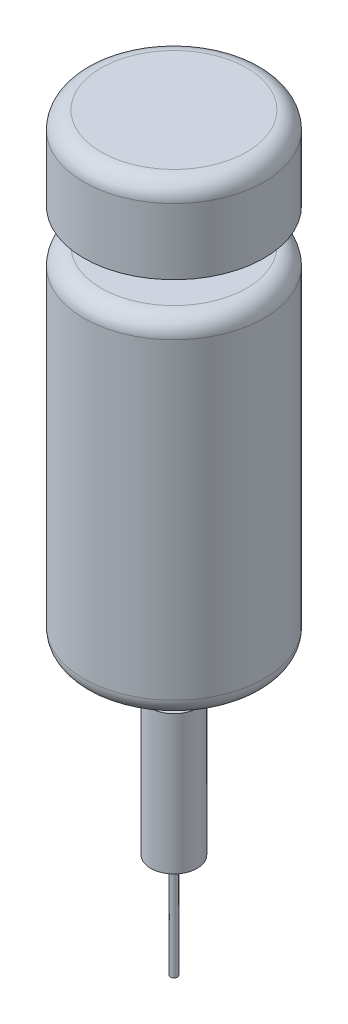
ISO-10303-21;
HEADER;
FILE_DESCRIPTION(('STEP AP214'),'2;1');
FILE_NAME('part.step','',(''),(''),'','','');
FILE_SCHEMA(('AUTOMOTIVE_DESIGN { 1 0 10303 214 1 1 1 1 }'));
ENDSEC;
DATA;
#1=APPLICATION_CONTEXT('core data for automotive mechanical design processes');
#2=APPLICATION_PROTOCOL_DEFINITION('international standard','automotive_design',2000,#1);
#3=PRODUCT_CONTEXT('',#1,'mechanical');
#4=PRODUCT('Part','Part','',(#3));
#5=PRODUCT_RELATED_PRODUCT_CATEGORY('part','',(#4));
#6=PRODUCT_DEFINITION_FORMATION('','',#4);
#7=PRODUCT_DEFINITION_CONTEXT('part definition',#1,'design');
#8=PRODUCT_DEFINITION('design','',#6,#7);
#9=PRODUCT_DEFINITION_SHAPE('','',#8);
#10=(LENGTH_UNIT() NAMED_UNIT(*) SI_UNIT(.MILLI.,.METRE.));
#11=(NAMED_UNIT(*) PLANE_ANGLE_UNIT() SI_UNIT($,.RADIAN.));
#12=(NAMED_UNIT(*) SI_UNIT($,.STERADIAN.) SOLID_ANGLE_UNIT());
#13=UNCERTAINTY_MEASURE_WITH_UNIT(LENGTH_MEASURE(1.E-05),#10,'distance_accuracy_value','');
#14=(GEOMETRIC_REPRESENTATION_CONTEXT(3) GLOBAL_UNCERTAINTY_ASSIGNED_CONTEXT((#13)) GLOBAL_UNIT_ASSIGNED_CONTEXT((#10,
#11,#12)) REPRESENTATION_CONTEXT('',''));
#15=CARTESIAN_POINT('',(0.,0.,0.));
#16=DIRECTION('',(0.,0.,1.));
#17=DIRECTION('',(1.,0.,0.));
#18=AXIS2_PLACEMENT_3D('',#15,#16,#17);
#19=CARTESIAN_POINT('',(0.,-52.,0.));
#20=DIRECTION('',(0.,-1.,0.));
#21=DIRECTION('',(0.,0.,-1.));
#22=AXIS2_PLACEMENT_3D('',#19,#20,#21);
#23=PLANE('',#22);
#24=CARTESIAN_POINT('',(0.,-52.,0.));
#25=DIRECTION('',(0.,-1.,0.));
#26=DIRECTION('',(0.,0.,-1.));
#27=AXIS2_PLACEMENT_3D('',#24,#25,#26);
#28=CIRCLE('',#27,6.69998497921417);
#29=CARTESIAN_POINT('',(0.,-52.,-6.69998497921417));
#30=VERTEX_POINT('',#29);
#31=EDGE_CURVE('E75',#30,#30,#28,.T.);
#32=ORIENTED_EDGE('',*,*,#31,.T.);
#33=EDGE_LOOP('',(#32));
#34=FACE_BOUND('',#33,.T.);
#35=CARTESIAN_POINT('',(0.,-52.,0.));
#36=DIRECTION('',(0.,-1.,0.));
#37=DIRECTION('',(0.,0.,-1.));
#38=AXIS2_PLACEMENT_3D('',#35,#36,#37);
#39=CIRCLE('',#38,1.);
#40=CARTESIAN_POINT('',(0.,-52.,-1.));
#41=VERTEX_POINT('',#40);
#42=EDGE_CURVE('E84',#41,#41,#39,.T.);
#43=ORIENTED_EDGE('',*,*,#42,.F.);
#44=EDGE_LOOP('',(#43));
#45=FACE_BOUND('',#44,.T.);
#46=ADVANCED_FACE('F30',(#34,#45),#23,.T.);
#47=CARTESIAN_POINT('',(0.,-8.,0.));
#48=DIRECTION('',(0.,-1.,0.));
#49=DIRECTION('',(0.,0.,-1.));
#50=AXIS2_PLACEMENT_3D('',#47,#48,#49);
#51=PLANE('',#50);
#52=CARTESIAN_POINT('',(0.,-8.,0.));
#53=DIRECTION('',(0.,-1.,0.));
#54=DIRECTION('',(0.,0.,-1.));
#55=AXIS2_PLACEMENT_3D('',#52,#53,#54);
#56=CIRCLE('',#55,10.);
#57=CARTESIAN_POINT('',(0.,-8.,-10.));
#58=VERTEX_POINT('',#57);
#59=EDGE_CURVE('E68',#58,#58,#56,.T.);
#60=ORIENTED_EDGE('',*,*,#59,.T.);
#61=EDGE_LOOP('',(#60));
#62=FACE_BOUND('',#61,.T.);
#63=CARTESIAN_POINT('',(0.,-8.,0.));
#64=DIRECTION('',(0.,-1.,0.));
#65=DIRECTION('',(0.,0.,-1.));
#66=AXIS2_PLACEMENT_3D('',#63,#64,#65);
#67=CIRCLE('',#66,2.93533656890052);
#68=CARTESIAN_POINT('',(0.,-8.,-2.93533656890052));
#69=VERTEX_POINT('',#68);
#70=EDGE_CURVE('E72',#69,#69,#67,.T.);
#71=ORIENTED_EDGE('',*,*,#70,.F.);
#72=EDGE_LOOP('',(#71));
#73=FACE_BOUND('',#72,.T.);
#74=ADVANCED_FACE('F100',(#62,#73),#51,.T.);
#75=CARTESIAN_POINT('',(0.,0.,0.));
#76=DIRECTION('',(0.,1.,0.));
#77=DIRECTION('',(0.,0.,1.));
#78=AXIS2_PLACEMENT_3D('',#75,#76,#77);
#79=PLANE('',#78);
#80=CARTESIAN_POINT('',(0.,0.,0.));
#81=DIRECTION('',(0.,1.,0.));
#82=DIRECTION('',(0.,0.,1.));
#83=AXIS2_PLACEMENT_3D('',#80,#81,#82);
#84=CIRCLE('',#83,21.);
#85=CARTESIAN_POINT('',(0.,0.,21.));
#86=VERTEX_POINT('',#85);
#87=EDGE_CURVE('E53',#86,#86,#84,.F.);
#88=ORIENTED_EDGE('',*,*,#87,.T.);
#89=EDGE_LOOP('',(#88));
#90=FACE_BOUND('',#89,.T.);
#91=CARTESIAN_POINT('',(0.,0.,0.));
#92=DIRECTION('',(0.,1.,0.));
#93=DIRECTION('',(0.,0.,1.));
#94=AXIS2_PLACEMENT_3D('',#91,#92,#93);
#95=CIRCLE('',#94,10.);
#96=CARTESIAN_POINT('',(0.,0.,10.));
#97=VERTEX_POINT('',#96);
#98=EDGE_CURVE('E10',#97,#97,#95,.F.);
#99=ORIENTED_EDGE('',*,*,#98,.F.);
#100=EDGE_LOOP('',(#99));
#101=FACE_BOUND('',#100,.T.);
#102=ADVANCED_FACE('F106',(#90,#101),#79,.F.);
#103=CARTESIAN_POINT('',(0.,100.,0.));
#104=DIRECTION('',(0.,1.,0.));
#105=DIRECTION('',(0.,0.,1.));
#106=AXIS2_PLACEMENT_3D('',#103,#104,#105);
#107=PLANE('',#106);
#108=CARTESIAN_POINT('',(0.,100.,0.));
#109=DIRECTION('',(0.,1.,0.));
#110=DIRECTION('',(0.,0.,1.));
#111=AXIS2_PLACEMENT_3D('',#108,#109,#110);
#112=CIRCLE('',#111,21.);
#113=CARTESIAN_POINT('',(0.,100.,21.));
#114=VERTEX_POINT('',#113);
#115=EDGE_CURVE('E50',#114,#114,#112,.T.);
#116=ORIENTED_EDGE('',*,*,#115,.T.);
#117=EDGE_LOOP('',(#116));
#118=FACE_BOUND('',#117,.T.);
#119=CARTESIAN_POINT('',(0.,100.,0.));
#120=DIRECTION('',(0.,1.,0.));
#121=DIRECTION('',(0.,0.,1.));
#122=AXIS2_PLACEMENT_3D('',#119,#120,#121);
#123=CIRCLE('',#122,7.5);
#124=CARTESIAN_POINT('',(0.,100.,7.5));
#125=VERTEX_POINT('',#124);
#126=EDGE_CURVE('E60',#125,#125,#123,.T.);
#127=ORIENTED_EDGE('',*,*,#126,.F.);
#128=EDGE_LOOP('',(#127));
#129=FACE_BOUND('',#128,.T.);
#130=ADVANCED_FACE('F143',(#118,#129),#107,.T.);
#131=CARTESIAN_POINT('',(0.,100.,0.));
#132=DIRECTION('',(0.,-1.,0.));
#133=DIRECTION('',(0.,0.,-1.));
#134=AXIS2_PLACEMENT_3D('',#131,#132,#133);
#135=CYLINDRICAL_SURFACE('',#134,26.);
#136=CARTESIAN_POINT('',(0.,95.,0.));
#137=DIRECTION('',(0.,1.,0.));
#138=DIRECTION('',(0.,0.,1.));
#139=AXIS2_PLACEMENT_3D('',#136,#137,#138);
#140=CIRCLE('',#139,26.);
#141=CARTESIAN_POINT('',(0.,95.,26.));
#142=VERTEX_POINT('',#141);
#143=EDGE_CURVE('E45',#142,#142,#140,.F.);
#144=ORIENTED_EDGE('',*,*,#143,.T.);
#145=EDGE_LOOP('',(#144));
#146=FACE_BOUND('',#145,.T.);
#147=CARTESIAN_POINT('',(0.,5.,0.));
#148=DIRECTION('',(0.,1.,0.));
#149=DIRECTION('',(0.,0.,1.));
#150=AXIS2_PLACEMENT_3D('',#147,#148,#149);
#151=CIRCLE('',#150,26.);
#152=CARTESIAN_POINT('',(0.,5.,26.));
#153=VERTEX_POINT('',#152);
#154=EDGE_CURVE('E56',#153,#153,#151,.T.);
#155=ORIENTED_EDGE('',*,*,#154,.T.);
#156=EDGE_LOOP('',(#155));
#157=FACE_BOUND('',#156,.T.);
#158=ADVANCED_FACE('F141',(#146,#157),#135,.T.);
#159=CARTESIAN_POINT('',(0.,110.,0.));
#160=DIRECTION('',(0.,-1.,0.));
#161=DIRECTION('',(0.,0.,-1.));
#162=AXIS2_PLACEMENT_3D('',#159,#160,#161);
#163=CYLINDRICAL_SURFACE('',#162,7.5);
#164=CARTESIAN_POINT('',(0.,110.,0.));
#165=DIRECTION('',(0.,1.,0.));
#166=DIRECTION('',(0.,0.,1.));
#167=AXIS2_PLACEMENT_3D('',#164,#165,#166);
#168=CIRCLE('',#167,7.5);
#169=CARTESIAN_POINT('',(0.,110.,7.5));
#170=VERTEX_POINT('',#169);
#171=EDGE_CURVE('E59',#170,#170,#168,.T.);
#172=ORIENTED_EDGE('',*,*,#171,.F.);
#173=EDGE_LOOP('',(#172));
#174=FACE_BOUND('',#173,.T.);
#175=ORIENTED_EDGE('',*,*,#126,.T.);
#176=EDGE_LOOP('',(#175));
#177=FACE_BOUND('',#176,.T.);
#178=ADVANCED_FACE('F135',(#174,#177),#163,.T.);
#179=CARTESIAN_POINT('',(0.,110.,0.));
#180=DIRECTION('',(0.,1.,0.));
#181=DIRECTION('',(0.,0.,1.));
#182=AXIS2_PLACEMENT_3D('',#179,#180,#181);
#183=PLANE('',#182);
#184=CARTESIAN_POINT('',(0.,110.,0.));
#185=DIRECTION('',(0.,1.,0.));
#186=DIRECTION('',(0.,0.,1.));
#187=AXIS2_PLACEMENT_3D('',#184,#185,#186);
#188=CIRCLE('',#187,26.);
#189=CARTESIAN_POINT('',(0.,110.,26.));
#190=VERTEX_POINT('',#189);
#191=EDGE_CURVE('E63',#190,#190,#188,.T.);
#192=ORIENTED_EDGE('',*,*,#191,.F.);
#193=EDGE_LOOP('',(#192));
#194=FACE_BOUND('',#193,.T.);
#195=ORIENTED_EDGE('',*,*,#171,.T.);
#196=EDGE_LOOP('',(#195));
#197=FACE_BOUND('',#196,.T.);
#198=ADVANCED_FACE('F132',(#194,#197),#183,.F.);
#199=CARTESIAN_POINT('',(0.,134.,0.));
#200=DIRECTION('',(0.,-1.,0.));
#201=DIRECTION('',(0.,0.,-1.));
#202=AXIS2_PLACEMENT_3D('',#199,#200,#201);
#203=CYLINDRICAL_SURFACE('',#202,26.);
#204=CARTESIAN_POINT('',(0.,129.,0.));
#205=DIRECTION('',(0.,1.,0.));
#206=DIRECTION('',(0.,0.,1.));
#207=AXIS2_PLACEMENT_3D('',#204,#205,#206);
#208=CIRCLE('',#207,26.);
#209=CARTESIAN_POINT('',(0.,129.,26.));
#210=VERTEX_POINT('',#209);
#211=EDGE_CURVE('E37',#210,#210,#208,.F.);
#212=ORIENTED_EDGE('',*,*,#211,.T.);
#213=EDGE_LOOP('',(#212));
#214=FACE_BOUND('',#213,.T.);
#215=ORIENTED_EDGE('',*,*,#191,.T.);
#216=EDGE_LOOP('',(#215));
#217=FACE_BOUND('',#216,.T.);
#218=ADVANCED_FACE('F130',(#214,#217),#203,.T.);
#219=CARTESIAN_POINT('',(0.,134.,0.));
#220=DIRECTION('',(0.,1.,0.));
#221=DIRECTION('',(0.,0.,1.));
#222=AXIS2_PLACEMENT_3D('',#219,#220,#221);
#223=PLANE('',#222);
#224=CARTESIAN_POINT('',(0.,134.,0.));
#225=DIRECTION('',(0.,1.,0.));
#226=DIRECTION('',(0.,0.,1.));
#227=AXIS2_PLACEMENT_3D('',#224,#225,#226);
#228=CIRCLE('',#227,21.);
#229=CARTESIAN_POINT('',(0.,134.,21.));
#230=VERTEX_POINT('',#229);
#231=EDGE_CURVE('E41',#230,#230,#228,.T.);
#232=ORIENTED_EDGE('',*,*,#231,.T.);
#233=EDGE_LOOP('',(#232));
#234=FACE_BOUND('',#233,.T.);
#235=ADVANCED_FACE('F126',(#234),#223,.T.);
#236=CARTESIAN_POINT('',(0.,5.,0.));
#237=DIRECTION('',(0.,1.,0.));
#238=DIRECTION('',(0.,0.,1.));
#239=AXIS2_PLACEMENT_3D('',#236,#237,#238);
#240=TOROIDAL_SURFACE('',#239,21.,5.);
#241=ORIENTED_EDGE('',*,*,#87,.F.);
#242=EDGE_LOOP('',(#241));
#243=FACE_BOUND('',#242,.T.);
#244=ORIENTED_EDGE('',*,*,#154,.F.);
#245=EDGE_LOOP('',(#244));
#246=FACE_BOUND('',#245,.T.);
#247=ADVANCED_FACE('F129',(#243,#246),#240,.T.);
#248=CARTESIAN_POINT('',(0.,95.,0.));
#249=DIRECTION('',(0.,1.,0.));
#250=DIRECTION('',(0.,0.,1.));
#251=AXIS2_PLACEMENT_3D('',#248,#249,#250);
#252=TOROIDAL_SURFACE('',#251,21.,5.);
#253=ORIENTED_EDGE('',*,*,#143,.F.);
#254=EDGE_LOOP('',(#253));
#255=FACE_BOUND('',#254,.T.);
#256=ORIENTED_EDGE('',*,*,#115,.F.);
#257=EDGE_LOOP('',(#256));
#258=FACE_BOUND('',#257,.T.);
#259=ADVANCED_FACE('F154',(#255,#258),#252,.T.);
#260=CARTESIAN_POINT('',(0.,129.,0.));
#261=DIRECTION('',(0.,1.,0.));
#262=DIRECTION('',(0.,0.,1.));
#263=AXIS2_PLACEMENT_3D('',#260,#261,#262);
#264=TOROIDAL_SURFACE('',#263,21.,5.);
#265=ORIENTED_EDGE('',*,*,#211,.F.);
#266=EDGE_LOOP('',(#265));
#267=FACE_BOUND('',#266,.T.);
#268=ORIENTED_EDGE('',*,*,#231,.F.);
#269=EDGE_LOOP('',(#268));
#270=FACE_BOUND('',#269,.T.);
#271=ADVANCED_FACE('F32',(#267,#270),#264,.T.);
#272=CARTESIAN_POINT('',(0.,-8.,0.));
#273=DIRECTION('',(0.,1.,0.));
#274=DIRECTION('',(0.,0.,1.));
#275=AXIS2_PLACEMENT_3D('',#272,#273,#274);
#276=CYLINDRICAL_SURFACE('',#275,10.);
#277=ORIENTED_EDGE('',*,*,#59,.F.);
#278=EDGE_LOOP('',(#277));
#279=FACE_BOUND('',#278,.T.);
#280=ORIENTED_EDGE('',*,*,#98,.T.);
#281=EDGE_LOOP('',(#280));
#282=FACE_BOUND('',#281,.T.);
#283=ADVANCED_FACE('F120',(#279,#282),#276,.T.);
#284=CARTESIAN_POINT('',(0.,-12.,0.));
#285=DIRECTION('',(0.,1.,0.));
#286=DIRECTION('',(0.,0.,1.));
#287=AXIS2_PLACEMENT_3D('',#284,#285,#286);
#288=CYLINDRICAL_SURFACE('',#287,2.93533656890052);
#289=CARTESIAN_POINT('',(0.,-12.,0.));
#290=DIRECTION('',(0.,-1.,0.));
#291=DIRECTION('',(0.,0.,-1.));
#292=AXIS2_PLACEMENT_3D('',#289,#290,#291);
#293=CIRCLE('',#292,2.93533656890052);
#294=CARTESIAN_POINT('',(0.,-12.,-2.93533656890052));
#295=VERTEX_POINT('',#294);
#296=EDGE_CURVE('E71',#295,#295,#293,.T.);
#297=ORIENTED_EDGE('',*,*,#296,.F.);
#298=EDGE_LOOP('',(#297));
#299=FACE_BOUND('',#298,.T.);
#300=ORIENTED_EDGE('',*,*,#70,.T.);
#301=EDGE_LOOP('',(#300));
#302=FACE_BOUND('',#301,.T.);
#303=ADVANCED_FACE('F114',(#299,#302),#288,.T.);
#304=CARTESIAN_POINT('',(0.,-12.,0.));
#305=DIRECTION('',(0.,-1.,0.));
#306=DIRECTION('',(0.,0.,-1.));
#307=AXIS2_PLACEMENT_3D('',#304,#305,#306);
#308=PLANE('',#307);
#309=CARTESIAN_POINT('',(0.,-12.,0.));
#310=DIRECTION('',(0.,-1.,0.));
#311=DIRECTION('',(0.,0.,-1.));
#312=AXIS2_PLACEMENT_3D('',#309,#310,#311);
#313=CIRCLE('',#312,6.69998497921417);
#314=CARTESIAN_POINT('',(0.,-12.,-6.69998497921417));
#315=VERTEX_POINT('',#314);
#316=EDGE_CURVE('E78',#315,#315,#313,.T.);
#317=ORIENTED_EDGE('',*,*,#316,.F.);
#318=EDGE_LOOP('',(#317));
#319=FACE_BOUND('',#318,.T.);
#320=ORIENTED_EDGE('',*,*,#296,.T.);
#321=EDGE_LOOP('',(#320));
#322=FACE_BOUND('',#321,.T.);
#323=ADVANCED_FACE('F111',(#319,#322),#308,.F.);
#324=CARTESIAN_POINT('',(0.,-52.,0.));
#325=DIRECTION('',(0.,1.,0.));
#326=DIRECTION('',(0.,0.,1.));
#327=AXIS2_PLACEMENT_3D('',#324,#325,#326);
#328=CYLINDRICAL_SURFACE('',#327,6.69998497921417);
#329=ORIENTED_EDGE('',*,*,#31,.F.);
#330=EDGE_LOOP('',(#329));
#331=FACE_BOUND('',#330,.T.);
#332=ORIENTED_EDGE('',*,*,#316,.T.);
#333=EDGE_LOOP('',(#332));
#334=FACE_BOUND('',#333,.T.);
#335=ADVANCED_FACE('F95',(#331,#334),#328,.T.);
#336=CARTESIAN_POINT('',(0.,-82.,0.));
#337=DIRECTION('',(0.,1.,0.));
#338=DIRECTION('',(0.,0.,1.));
#339=AXIS2_PLACEMENT_3D('',#336,#337,#338);
#340=CYLINDRICAL_SURFACE('',#339,1.);
#341=CARTESIAN_POINT('',(0.,-82.,0.));
#342=DIRECTION('',(0.,-1.,0.));
#343=DIRECTION('',(0.,0.,-1.));
#344=AXIS2_PLACEMENT_3D('',#341,#342,#343);
#345=CIRCLE('',#344,1.);
#346=CARTESIAN_POINT('',(0.,-82.,-1.));
#347=VERTEX_POINT('',#346);
#348=EDGE_CURVE('E81',#347,#347,#345,.T.);
#349=ORIENTED_EDGE('',*,*,#348,.F.);
#350=EDGE_LOOP('',(#349));
#351=FACE_BOUND('',#350,.T.);
#352=ORIENTED_EDGE('',*,*,#42,.T.);
#353=EDGE_LOOP('',(#352));
#354=FACE_BOUND('',#353,.T.);
#355=ADVANCED_FACE('F92',(#351,#354),#340,.T.);
#356=CARTESIAN_POINT('',(0.,-82.,0.));
#357=DIRECTION('',(0.,-1.,0.));
#358=DIRECTION('',(0.,0.,-1.));
#359=AXIS2_PLACEMENT_3D('',#356,#357,#358);
#360=PLANE('',#359);
#361=ORIENTED_EDGE('',*,*,#348,.T.);
#362=EDGE_LOOP('',(#361));
#363=FACE_BOUND('',#362,.T.);
#364=ADVANCED_FACE('F90',(#363),#360,.T.);
#365=CLOSED_SHELL('',(#46,#74,#102,#130,#158,#178,#198,#218,#235,#247,#259,#271,#283,#303,#323,
#335,#355,#364));
#366=MANIFOLD_SOLID_BREP('B2',#365);
#367=ADVANCED_BREP_SHAPE_REPRESENTATION('',(#18,#366),#14);
#368=SHAPE_DEFINITION_REPRESENTATION(#9,#367);
ENDSEC;
END-ISO-10303-21;
